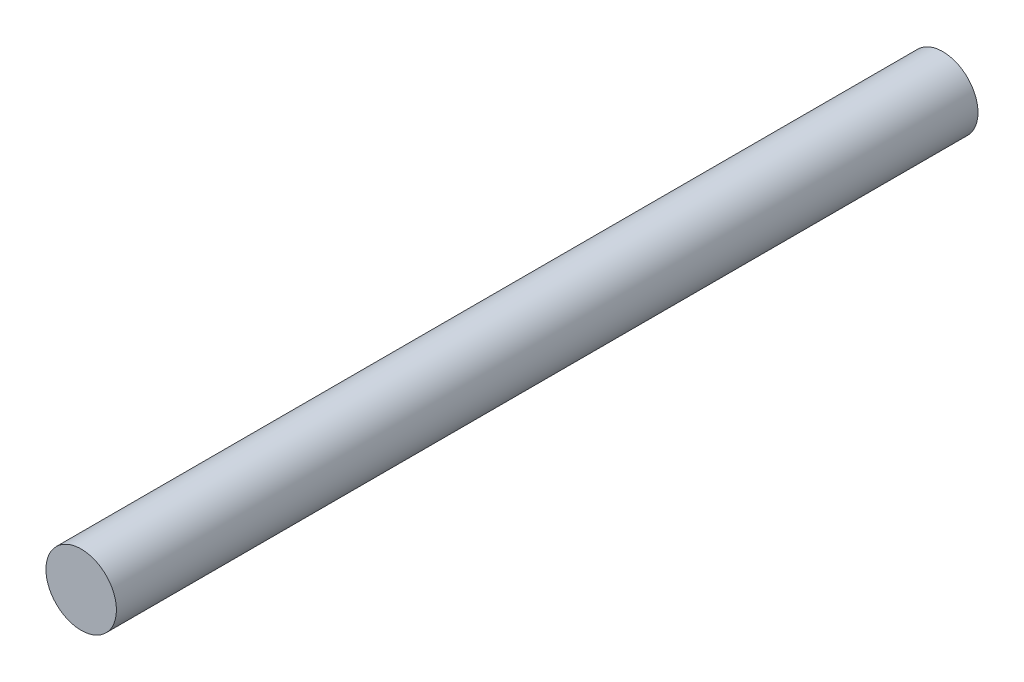
ISO-10303-21;
HEADER;
FILE_DESCRIPTION(('STEP AP214'),'2;1');
FILE_NAME('part.step','',(''),(''),'','','');
FILE_SCHEMA(('AUTOMOTIVE_DESIGN { 1 0 10303 214 1 1 1 1 }'));
ENDSEC;
DATA;
#1=APPLICATION_CONTEXT('core data for automotive mechanical design processes');
#2=APPLICATION_PROTOCOL_DEFINITION('international standard','automotive_design',2000,#1);
#3=PRODUCT_CONTEXT('',#1,'mechanical');
#4=PRODUCT('Part','Part','',(#3));
#5=PRODUCT_RELATED_PRODUCT_CATEGORY('part','',(#4));
#6=PRODUCT_DEFINITION_FORMATION('','',#4);
#7=PRODUCT_DEFINITION_CONTEXT('part definition',#1,'design');
#8=PRODUCT_DEFINITION('design','',#6,#7);
#9=PRODUCT_DEFINITION_SHAPE('','',#8);
#10=(LENGTH_UNIT() NAMED_UNIT(*) SI_UNIT(.MILLI.,.METRE.));
#11=(NAMED_UNIT(*) PLANE_ANGLE_UNIT() SI_UNIT($,.RADIAN.));
#12=(NAMED_UNIT(*) SI_UNIT($,.STERADIAN.) SOLID_ANGLE_UNIT());
#13=UNCERTAINTY_MEASURE_WITH_UNIT(LENGTH_MEASURE(1.E-05),#10,'distance_accuracy_value','');
#14=(GEOMETRIC_REPRESENTATION_CONTEXT(3) GLOBAL_UNCERTAINTY_ASSIGNED_CONTEXT((#13)) GLOBAL_UNIT_ASSIGNED_CONTEXT((#10,
#11,#12)) REPRESENTATION_CONTEXT('',''));
#15=CARTESIAN_POINT('',(0.,0.,0.));
#16=DIRECTION('',(0.,0.,1.));
#17=DIRECTION('',(1.,0.,0.));
#18=AXIS2_PLACEMENT_3D('',#15,#16,#17);
#19=CARTESIAN_POINT('',(0.,0.,110.));
#20=DIRECTION('',(0.,0.,-1.));
#21=DIRECTION('',(-1.,0.,0.));
#22=AXIS2_PLACEMENT_3D('',#19,#20,#21);
#23=CYLINDRICAL_SURFACE('',#22,4.5);
#24=CARTESIAN_POINT('',(0.,0.,110.));
#25=DIRECTION('',(0.,0.,1.));
#26=DIRECTION('',(1.,0.,0.));
#27=AXIS2_PLACEMENT_3D('',#24,#25,#26);
#28=CIRCLE('',#27,4.5);
#29=CARTESIAN_POINT('',(4.5,0.,110.));
#30=VERTEX_POINT('',#29);
#31=EDGE_CURVE('E10',#30,#30,#28,.T.);
#32=ORIENTED_EDGE('',*,*,#31,.F.);
#33=EDGE_LOOP('',(#32));
#34=FACE_BOUND('',#33,.T.);
#35=CARTESIAN_POINT('',(0.,0.,0.));
#36=DIRECTION('',(0.,0.,1.));
#37=DIRECTION('',(1.,0.,0.));
#38=AXIS2_PLACEMENT_3D('',#35,#36,#37);
#39=CIRCLE('',#38,4.5);
#40=CARTESIAN_POINT('',(4.5,0.,0.));
#41=VERTEX_POINT('',#40);
#42=EDGE_CURVE('E33',#41,#41,#39,.T.);
#43=ORIENTED_EDGE('',*,*,#42,.T.);
#44=EDGE_LOOP('',(#43));
#45=FACE_BOUND('',#44,.T.);
#46=ADVANCED_FACE('F30',(#34,#45),#23,.T.);
#47=CARTESIAN_POINT('',(0.,0.,110.));
#48=DIRECTION('',(0.,0.,1.));
#49=DIRECTION('',(1.,0.,0.));
#50=AXIS2_PLACEMENT_3D('',#47,#48,#49);
#51=PLANE('',#50);
#52=ORIENTED_EDGE('',*,*,#31,.T.);
#53=EDGE_LOOP('',(#52));
#54=FACE_BOUND('',#53,.T.);
#55=ADVANCED_FACE('F45',(#54),#51,.T.);
#56=CARTESIAN_POINT('',(0.,0.,0.));
#57=DIRECTION('',(0.,0.,1.));
#58=DIRECTION('',(1.,0.,0.));
#59=AXIS2_PLACEMENT_3D('',#56,#57,#58);
#60=PLANE('',#59);
#61=ORIENTED_EDGE('',*,*,#42,.F.);
#62=EDGE_LOOP('',(#61));
#63=FACE_BOUND('',#62,.T.);
#64=ADVANCED_FACE('F43',(#63),#60,.F.);
#65=CLOSED_SHELL('',(#46,#55,#64));
#66=MANIFOLD_SOLID_BREP('B2',#65);
#67=ADVANCED_BREP_SHAPE_REPRESENTATION('',(#18,#66),#14);
#68=SHAPE_DEFINITION_REPRESENTATION(#9,#67);
ENDSEC;
END-ISO-10303-21;
